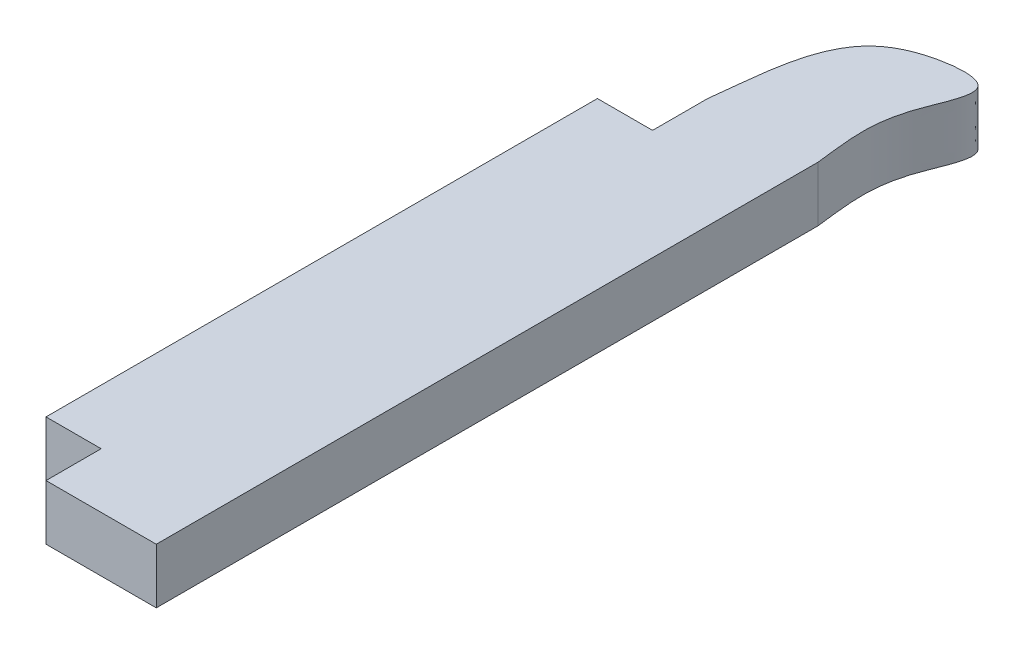
ISO-10303-21;
HEADER;
FILE_DESCRIPTION(('STEP AP214'),'2;1');
FILE_NAME('part.step','',(''),(''),'','','');
FILE_SCHEMA(('AUTOMOTIVE_DESIGN { 1 0 10303 214 1 1 1 1 }'));
ENDSEC;
DATA;
#1=APPLICATION_CONTEXT('core data for automotive mechanical design processes');
#2=APPLICATION_PROTOCOL_DEFINITION('international standard','automotive_design',2000,#1);
#3=PRODUCT_CONTEXT('',#1,'mechanical');
#4=PRODUCT('Part','Part','',(#3));
#5=PRODUCT_RELATED_PRODUCT_CATEGORY('part','',(#4));
#6=PRODUCT_DEFINITION_FORMATION('','',#4);
#7=PRODUCT_DEFINITION_CONTEXT('part definition',#1,'design');
#8=PRODUCT_DEFINITION('design','',#6,#7);
#9=PRODUCT_DEFINITION_SHAPE('','',#8);
#10=(LENGTH_UNIT() NAMED_UNIT(*) SI_UNIT(.MILLI.,.METRE.));
#11=(NAMED_UNIT(*) PLANE_ANGLE_UNIT() SI_UNIT($,.RADIAN.));
#12=(NAMED_UNIT(*) SI_UNIT($,.STERADIAN.) SOLID_ANGLE_UNIT());
#13=UNCERTAINTY_MEASURE_WITH_UNIT(LENGTH_MEASURE(1.E-05),#10,'distance_accuracy_value','');
#14=(GEOMETRIC_REPRESENTATION_CONTEXT(3) GLOBAL_UNCERTAINTY_ASSIGNED_CONTEXT((#13)) GLOBAL_UNIT_ASSIGNED_CONTEXT((#10,
#11,#12)) REPRESENTATION_CONTEXT('',''));
#15=CARTESIAN_POINT('',(0.,0.,0.));
#16=DIRECTION('',(0.,0.,1.));
#17=DIRECTION('',(1.,0.,0.));
#18=AXIS2_PLACEMENT_3D('',#15,#16,#17);
#19=CARTESIAN_POINT('',(-3.175,3.175,-19.05));
#20=CARTESIAN_POINT('',(-2.8900214937932,3.175,-21.1314834570951));
#21=CARTESIAN_POINT('',(-2.84495879102213,3.175,-25.5906788052733));
#22=CARTESIAN_POINT('',(0.84165205301301,3.175,-27.7038191653215));
#23=CARTESIAN_POINT('',(5.03546359071696,3.175,-28.046576523332));
#24=CARTESIAN_POINT('',(2.53434527468834,3.175,-23.2833637816734));
#25=CARTESIAN_POINT('',(2.94743086362944,3.175,-21.0616177376061));
#26=CARTESIAN_POINT('',(3.175,3.175,-19.05));
#27=B_SPLINE_CURVE_WITH_KNOTS('',3,(#19,#20,#21,#22,#23,#24,#25,#26),.UNSPECIFIED.,.F.,.F.,(4,1,
1,1,1,4),(0.,0.335744056722791,0.477587417853493,0.60696459793486,0.742564211241728,1.),.UNSPECIFIED.);
#28=DIRECTION('',(0.,-1.,0.));
#29=VECTOR('',#28,1.);
#30=SURFACE_OF_LINEAR_EXTRUSION('',#27,#29);
#31=CARTESIAN_POINT('',(-3.175,0.,-19.05));
#32=CARTESIAN_POINT('',(-2.8900214937932,0.,-21.1314834570951));
#33=CARTESIAN_POINT('',(-2.84495879102213,0.,-25.5906788052733));
#34=CARTESIAN_POINT('',(0.84165205301301,0.,-27.7038191653215));
#35=CARTESIAN_POINT('',(5.03546359071696,0.,-28.046576523332));
#36=CARTESIAN_POINT('',(2.53434527468834,0.,-23.2833637816734));
#37=CARTESIAN_POINT('',(2.94743086362944,0.,-21.0616177376061));
#38=CARTESIAN_POINT('',(3.175,0.,-19.05));
#39=B_SPLINE_CURVE_WITH_KNOTS('',3,(#31,#32,#33,#34,#35,#36,#37,#38),.UNSPECIFIED.,.F.,.F.,(4,1,
1,1,1,4),(0.,0.335744056722791,0.477587417853493,0.60696459793486,0.742564211241728,1.),.UNSPECIFIED.);
#40=CARTESIAN_POINT('',(-3.175,0.,-19.05));
#41=VERTEX_POINT('',#40);
#42=CARTESIAN_POINT('',(3.175,0.,-19.05));
#43=VERTEX_POINT('',#42);
#44=EDGE_CURVE('E129',#41,#43,#39,.T.);
#45=ORIENTED_EDGE('',*,*,#44,.F.);
#46=DIRECTION('',(0.,-1.,0.));
#47=VECTOR('',#46,1.);
#48=CARTESIAN_POINT('',(-3.175,3.175,-19.05));
#49=LINE('',#48,#47);
#50=CARTESIAN_POINT('',(-3.175,3.175,-19.05));
#51=VERTEX_POINT('',#50);
#52=EDGE_CURVE('E11',#51,#41,#49,.T.);
#53=ORIENTED_EDGE('',*,*,#52,.F.);
#54=CARTESIAN_POINT('',(3.175,3.175,-19.05));
#55=VERTEX_POINT('',#54);
#56=EDGE_CURVE('E152',#51,#55,#27,.T.);
#57=ORIENTED_EDGE('',*,*,#56,.T.);
#58=DIRECTION('',(0.,-1.,0.));
#59=VECTOR('',#58,1.);
#60=CARTESIAN_POINT('',(3.175,3.175,-19.05));
#61=LINE('',#60,#59);
#62=EDGE_CURVE('E85',#55,#43,#61,.T.);
#63=ORIENTED_EDGE('',*,*,#62,.T.);
#64=EDGE_LOOP('',(#45,#53,#57,#63));
#65=FACE_BOUND('',#64,.T.);
#66=ADVANCED_FACE('F33',(#65),#30,.T.);
#67=CARTESIAN_POINT('',(-3.175,3.175,0.));
#68=DIRECTION('',(-1.,0.,0.));
#69=DIRECTION('',(0.,0.,1.));
#70=AXIS2_PLACEMENT_3D('',#67,#68,#69);
#71=PLANE('',#70);
#72=DIRECTION('',(0.,0.,-1.));
#73=VECTOR('',#72,1.);
#74=CARTESIAN_POINT('',(-3.175,0.,0.));
#75=LINE('',#74,#73);
#76=CARTESIAN_POINT('',(-3.175,0.,-15.875));
#77=VERTEX_POINT('',#76);
#78=EDGE_CURVE('E133',#77,#41,#75,.T.);
#79=ORIENTED_EDGE('',*,*,#78,.F.);
#80=DIRECTION('',(0.,-1.,0.));
#81=VECTOR('',#80,1.);
#82=CARTESIAN_POINT('',(-3.175,3.175,-15.875));
#83=LINE('',#82,#81);
#84=CARTESIAN_POINT('',(-3.175,3.175,-15.875));
#85=VERTEX_POINT('',#84);
#86=EDGE_CURVE('E42',#85,#77,#83,.T.);
#87=ORIENTED_EDGE('',*,*,#86,.F.);
#88=DIRECTION('',(0.,0.,-1.));
#89=VECTOR('',#88,1.);
#90=CARTESIAN_POINT('',(-3.175,3.175,0.));
#91=LINE('',#90,#89);
#92=EDGE_CURVE('E172',#85,#51,#91,.T.);
#93=ORIENTED_EDGE('',*,*,#92,.T.);
#94=ORIENTED_EDGE('',*,*,#52,.T.);
#95=EDGE_LOOP('',(#79,#87,#93,#94));
#96=FACE_BOUND('',#95,.T.);
#97=ADVANCED_FACE('F171',(#96),#71,.T.);
#98=CARTESIAN_POINT('',(0.,3.175,-15.875));
#99=DIRECTION('',(0.,0.,1.));
#100=DIRECTION('',(1.,0.,0.));
#101=AXIS2_PLACEMENT_3D('',#98,#99,#100);
#102=PLANE('',#101);
#103=DIRECTION('',(-1.,0.,0.));
#104=VECTOR('',#103,1.);
#105=CARTESIAN_POINT('',(0.,0.,-15.875));
#106=LINE('',#105,#104);
#107=CARTESIAN_POINT('',(-6.35,0.,-15.875));
#108=VERTEX_POINT('',#107);
#109=EDGE_CURVE('E139',#77,#108,#106,.T.);
#110=ORIENTED_EDGE('',*,*,#109,.T.);
#111=DIRECTION('',(0.,-1.,0.));
#112=VECTOR('',#111,1.);
#113=CARTESIAN_POINT('',(-6.35,3.175,-15.875));
#114=LINE('',#113,#112);
#115=CARTESIAN_POINT('',(-6.35,3.175,-15.875));
#116=VERTEX_POINT('',#115);
#117=EDGE_CURVE('E158',#116,#108,#114,.T.);
#118=ORIENTED_EDGE('',*,*,#117,.F.);
#119=DIRECTION('',(-1.,0.,0.));
#120=VECTOR('',#119,1.);
#121=CARTESIAN_POINT('',(0.,3.175,-15.875));
#122=LINE('',#121,#120);
#123=EDGE_CURVE('E164',#85,#116,#122,.T.);
#124=ORIENTED_EDGE('',*,*,#123,.F.);
#125=ORIENTED_EDGE('',*,*,#86,.T.);
#126=EDGE_LOOP('',(#110,#118,#124,#125));
#127=FACE_BOUND('',#126,.T.);
#128=ADVANCED_FACE('F162',(#127),#102,.F.);
#129=CARTESIAN_POINT('',(-6.35,3.175,0.));
#130=DIRECTION('',(-1.,0.,0.));
#131=DIRECTION('',(0.,0.,1.));
#132=AXIS2_PLACEMENT_3D('',#129,#130,#131);
#133=PLANE('',#132);
#134=DIRECTION('',(0.,0.,-1.));
#135=VECTOR('',#134,1.);
#136=CARTESIAN_POINT('',(-6.35,0.,0.));
#137=LINE('',#136,#135);
#138=CARTESIAN_POINT('',(-6.35,0.,15.875));
#139=VERTEX_POINT('',#138);
#140=EDGE_CURVE('E142',#139,#108,#137,.T.);
#141=ORIENTED_EDGE('',*,*,#140,.F.);
#142=DIRECTION('',(0.,-1.,0.));
#143=VECTOR('',#142,1.);
#144=CARTESIAN_POINT('',(-6.35,3.175,15.875));
#145=LINE('',#144,#143);
#146=CARTESIAN_POINT('',(-6.35,3.175,15.875));
#147=VERTEX_POINT('',#146);
#148=EDGE_CURVE('E156',#147,#139,#145,.T.);
#149=ORIENTED_EDGE('',*,*,#148,.F.);
#150=DIRECTION('',(0.,0.,-1.));
#151=VECTOR('',#150,1.);
#152=CARTESIAN_POINT('',(-6.35,3.175,0.));
#153=LINE('',#152,#151);
#154=EDGE_CURVE('E286',#147,#116,#153,.T.);
#155=ORIENTED_EDGE('',*,*,#154,.T.);
#156=ORIENTED_EDGE('',*,*,#117,.T.);
#157=EDGE_LOOP('',(#141,#149,#155,#156));
#158=FACE_BOUND('',#157,.T.);
#159=ADVANCED_FACE('F180',(#158),#133,.T.);
#160=CARTESIAN_POINT('',(0.,3.175,15.875));
#161=DIRECTION('',(0.,0.,1.));
#162=DIRECTION('',(1.,0.,0.));
#163=AXIS2_PLACEMENT_3D('',#160,#161,#162);
#164=PLANE('',#163);
#165=DIRECTION('',(-1.,0.,0.));
#166=VECTOR('',#165,1.);
#167=CARTESIAN_POINT('',(0.,0.,15.875));
#168=LINE('',#167,#166);
#169=CARTESIAN_POINT('',(-3.175,0.,15.875));
#170=VERTEX_POINT('',#169);
#171=EDGE_CURVE('E145',#170,#139,#168,.T.);
#172=ORIENTED_EDGE('',*,*,#171,.F.);
#173=DIRECTION('',(0.,-1.,0.));
#174=VECTOR('',#173,1.);
#175=CARTESIAN_POINT('',(-3.175,3.175,15.875));
#176=LINE('',#175,#174);
#177=CARTESIAN_POINT('',(-3.175,3.175,15.875));
#178=VERTEX_POINT('',#177);
#179=EDGE_CURVE('E121',#178,#170,#176,.T.);
#180=ORIENTED_EDGE('',*,*,#179,.F.);
#181=DIRECTION('',(-1.,0.,0.));
#182=VECTOR('',#181,1.);
#183=CARTESIAN_POINT('',(0.,3.175,15.875));
#184=LINE('',#183,#182);
#185=EDGE_CURVE('E111',#178,#147,#184,.T.);
#186=ORIENTED_EDGE('',*,*,#185,.T.);
#187=ORIENTED_EDGE('',*,*,#148,.T.);
#188=EDGE_LOOP('',(#172,#180,#186,#187));
#189=FACE_BOUND('',#188,.T.);
#190=ADVANCED_FACE('F185',(#189),#164,.T.);
#191=CARTESIAN_POINT('',(-3.175,3.175,0.));
#192=DIRECTION('',(1.,0.,0.));
#193=DIRECTION('',(0.,0.,-1.));
#194=AXIS2_PLACEMENT_3D('',#191,#192,#193);
#195=PLANE('',#194);
#196=DIRECTION('',(0.,0.,1.));
#197=VECTOR('',#196,1.);
#198=CARTESIAN_POINT('',(-3.175,0.,0.));
#199=LINE('',#198,#197);
#200=CARTESIAN_POINT('',(-3.175,0.,19.05));
#201=VERTEX_POINT('',#200);
#202=EDGE_CURVE('E118',#170,#201,#199,.T.);
#203=ORIENTED_EDGE('',*,*,#202,.T.);
#204=DIRECTION('',(0.,-1.,0.));
#205=VECTOR('',#204,1.);
#206=CARTESIAN_POINT('',(-3.175,3.175,19.05));
#207=LINE('',#206,#205);
#208=CARTESIAN_POINT('',(-3.175,3.175,19.05));
#209=VERTEX_POINT('',#208);
#210=EDGE_CURVE('E115',#209,#201,#207,.T.);
#211=ORIENTED_EDGE('',*,*,#210,.F.);
#212=DIRECTION('',(0.,0.,1.));
#213=VECTOR('',#212,1.);
#214=CARTESIAN_POINT('',(-3.175,3.175,0.));
#215=LINE('',#214,#213);
#216=EDGE_CURVE('E103',#178,#209,#215,.T.);
#217=ORIENTED_EDGE('',*,*,#216,.F.);
#218=ORIENTED_EDGE('',*,*,#179,.T.);
#219=EDGE_LOOP('',(#203,#211,#217,#218));
#220=FACE_BOUND('',#219,.T.);
#221=ADVANCED_FACE('F116',(#220),#195,.F.);
#222=CARTESIAN_POINT('',(0.,3.175,19.05));
#223=DIRECTION('',(0.,0.,-1.));
#224=DIRECTION('',(-1.,0.,0.));
#225=AXIS2_PLACEMENT_3D('',#222,#223,#224);
#226=PLANE('',#225);
#227=DIRECTION('',(1.,0.,0.));
#228=VECTOR('',#227,1.);
#229=CARTESIAN_POINT('',(0.,0.,19.05));
#230=LINE('',#229,#228);
#231=CARTESIAN_POINT('',(3.175,0.,19.05));
#232=VERTEX_POINT('',#231);
#233=EDGE_CURVE('E149',#201,#232,#230,.T.);
#234=ORIENTED_EDGE('',*,*,#233,.T.);
#235=DIRECTION('',(0.,-1.,0.));
#236=VECTOR('',#235,1.);
#237=CARTESIAN_POINT('',(3.175,3.175,19.05));
#238=LINE('',#237,#236);
#239=CARTESIAN_POINT('',(3.175,3.175,19.05));
#240=VERTEX_POINT('',#239);
#241=EDGE_CURVE('E122',#240,#232,#238,.T.);
#242=ORIENTED_EDGE('',*,*,#241,.F.);
#243=DIRECTION('',(1.,0.,0.));
#244=VECTOR('',#243,1.);
#245=CARTESIAN_POINT('',(0.,3.175,19.05));
#246=LINE('',#245,#244);
#247=EDGE_CURVE('E107',#209,#240,#246,.T.);
#248=ORIENTED_EDGE('',*,*,#247,.F.);
#249=ORIENTED_EDGE('',*,*,#210,.T.);
#250=EDGE_LOOP('',(#234,#242,#248,#249));
#251=FACE_BOUND('',#250,.T.);
#252=ADVANCED_FACE('F124',(#251),#226,.F.);
#253=CARTESIAN_POINT('',(3.175,3.175,0.));
#254=DIRECTION('',(-1.,0.,0.));
#255=DIRECTION('',(0.,0.,1.));
#256=AXIS2_PLACEMENT_3D('',#253,#254,#255);
#257=PLANE('',#256);
#258=DIRECTION('',(0.,0.,-1.));
#259=VECTOR('',#258,1.);
#260=CARTESIAN_POINT('',(3.175,0.,0.));
#261=LINE('',#260,#259);
#262=EDGE_CURVE('E78',#232,#43,#261,.T.);
#263=ORIENTED_EDGE('',*,*,#262,.T.);
#264=ORIENTED_EDGE('',*,*,#62,.F.);
#265=DIRECTION('',(0.,0.,1.));
#266=VECTOR('',#265,1.);
#267=CARTESIAN_POINT('',(3.175,3.175,0.));
#268=LINE('',#267,#266);
#269=EDGE_CURVE('E50',#55,#240,#268,.T.);
#270=ORIENTED_EDGE('',*,*,#269,.T.);
#271=ORIENTED_EDGE('',*,*,#241,.T.);
#272=EDGE_LOOP('',(#263,#264,#270,#271));
#273=FACE_BOUND('',#272,.T.);
#274=ADVANCED_FACE('F191',(#273),#257,.F.);
#275=CARTESIAN_POINT('',(0.,3.175,0.));
#276=DIRECTION('',(0.,1.,0.));
#277=DIRECTION('',(0.,0.,1.));
#278=AXIS2_PLACEMENT_3D('',#275,#276,#277);
#279=PLANE('',#278);
#280=ORIENTED_EDGE('',*,*,#269,.F.);
#281=ORIENTED_EDGE('',*,*,#56,.F.);
#282=ORIENTED_EDGE('',*,*,#92,.F.);
#283=ORIENTED_EDGE('',*,*,#123,.T.);
#284=ORIENTED_EDGE('',*,*,#154,.F.);
#285=ORIENTED_EDGE('',*,*,#185,.F.);
#286=ORIENTED_EDGE('',*,*,#216,.T.);
#287=ORIENTED_EDGE('',*,*,#247,.T.);
#288=EDGE_LOOP('',(#280,#281,#282,#283,#284,#285,#286,#287));
#289=FACE_BOUND('',#288,.T.);
#290=ADVANCED_FACE('F105',(#289),#279,.T.);
#291=CARTESIAN_POINT('',(0.,0.,0.));
#292=DIRECTION('',(0.,1.,0.));
#293=DIRECTION('',(0.,0.,1.));
#294=AXIS2_PLACEMENT_3D('',#291,#292,#293);
#295=PLANE('',#294);
#296=ORIENTED_EDGE('',*,*,#262,.F.);
#297=ORIENTED_EDGE('',*,*,#233,.F.);
#298=ORIENTED_EDGE('',*,*,#202,.F.);
#299=ORIENTED_EDGE('',*,*,#171,.T.);
#300=ORIENTED_EDGE('',*,*,#140,.T.);
#301=ORIENTED_EDGE('',*,*,#109,.F.);
#302=ORIENTED_EDGE('',*,*,#78,.T.);
#303=ORIENTED_EDGE('',*,*,#44,.T.);
#304=EDGE_LOOP('',(#296,#297,#298,#299,#300,#301,#302,#303));
#305=FACE_BOUND('',#304,.T.);
#306=ADVANCED_FACE('F169',(#305),#295,.F.);
#307=CLOSED_SHELL('',(#66,#97,#128,#159,#190,#221,#252,#274,#290,#306));
#308=MANIFOLD_SOLID_BREP('B2',#307);
#309=ADVANCED_BREP_SHAPE_REPRESENTATION('',(#18,#308),#14);
#310=SHAPE_DEFINITION_REPRESENTATION(#9,#309);
ENDSEC;
END-ISO-10303-21;
